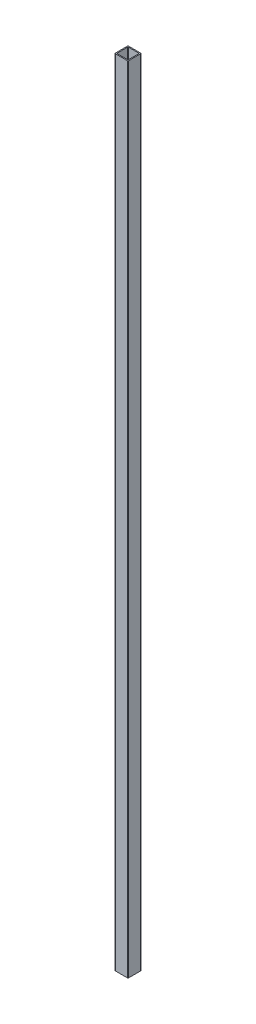
ISO-10303-21;
HEADER;
FILE_DESCRIPTION(('STEP AP214'),'2;1');
FILE_NAME('part.step','',(''),(''),'','','');
FILE_SCHEMA(('AUTOMOTIVE_DESIGN { 1 0 10303 214 1 1 1 1 }'));
ENDSEC;
DATA;
#1=APPLICATION_CONTEXT('core data for automotive mechanical design processes');
#2=APPLICATION_PROTOCOL_DEFINITION('international standard','automotive_design',2000,#1);
#3=PRODUCT_CONTEXT('',#1,'mechanical');
#4=PRODUCT('Part','Part','',(#3));
#5=PRODUCT_RELATED_PRODUCT_CATEGORY('part','',(#4));
#6=PRODUCT_DEFINITION_FORMATION('','',#4);
#7=PRODUCT_DEFINITION_CONTEXT('part definition',#1,'design');
#8=PRODUCT_DEFINITION('design','',#6,#7);
#9=PRODUCT_DEFINITION_SHAPE('','',#8);
#10=(LENGTH_UNIT() NAMED_UNIT(*) SI_UNIT(.MILLI.,.METRE.));
#11=(NAMED_UNIT(*) PLANE_ANGLE_UNIT() SI_UNIT($,.RADIAN.));
#12=(NAMED_UNIT(*) SI_UNIT($,.STERADIAN.) SOLID_ANGLE_UNIT());
#13=UNCERTAINTY_MEASURE_WITH_UNIT(LENGTH_MEASURE(1.E-05),#10,'distance_accuracy_value','');
#14=(GEOMETRIC_REPRESENTATION_CONTEXT(3) GLOBAL_UNCERTAINTY_ASSIGNED_CONTEXT((#13)) GLOBAL_UNIT_ASSIGNED_CONTEXT((#10,
#11,#12)) REPRESENTATION_CONTEXT('',''));
#15=CARTESIAN_POINT('',(0.,0.,0.));
#16=DIRECTION('',(0.,0.,1.));
#17=DIRECTION('',(1.,0.,0.));
#18=AXIS2_PLACEMENT_3D('',#15,#16,#17);
#19=CARTESIAN_POINT('',(-9.,1200.,-9.));
#20=DIRECTION('',(0.,-1.,0.));
#21=DIRECTION('',(0.,0.,1.));
#22=AXIS2_PLACEMENT_3D('',#19,#20,#21);
#23=PLANE('',#22);
#24=CARTESIAN_POINT('',(-9.,1200.,-9.));
#25=DIRECTION('',(0.,-1.,0.));
#26=DIRECTION('',(0.,0.,1.));
#27=AXIS2_PLACEMENT_3D('',#24,#25,#26);
#28=CIRCLE('',#27,0.999999999999999);
#29=CARTESIAN_POINT('',(-10.,1200.,-8.99999999999999));
#30=VERTEX_POINT('',#29);
#31=CARTESIAN_POINT('',(-8.99999999999999,1200.,-10.));
#32=VERTEX_POINT('',#31);
#33=EDGE_CURVE('E215',#30,#32,#28,.T.);
#34=ORIENTED_EDGE('',*,*,#33,.F.);
#35=DIRECTION('',(0.,0.,-1.));
#36=VECTOR('',#35,1.);
#37=CARTESIAN_POINT('',(-10.,1200.,-8.99999999999999));
#38=LINE('',#37,#36);
#39=CARTESIAN_POINT('',(-10.,1200.,8.99999999999999));
#40=VERTEX_POINT('',#39);
#41=EDGE_CURVE('E237',#40,#30,#38,.T.);
#42=ORIENTED_EDGE('',*,*,#41,.F.);
#43=CARTESIAN_POINT('',(-9.,1200.,9.));
#44=DIRECTION('',(0.,-1.,0.));
#45=DIRECTION('',(0.,0.,1.));
#46=AXIS2_PLACEMENT_3D('',#43,#44,#45);
#47=CIRCLE('',#46,0.999999999999999);
#48=CARTESIAN_POINT('',(-8.99999999999999,1200.,10.));
#49=VERTEX_POINT('',#48);
#50=EDGE_CURVE('E234',#49,#40,#47,.T.);
#51=ORIENTED_EDGE('',*,*,#50,.F.);
#52=DIRECTION('',(-1.,0.,0.));
#53=VECTOR('',#52,1.);
#54=CARTESIAN_POINT('',(-8.99999999999999,1200.,10.));
#55=LINE('',#54,#53);
#56=CARTESIAN_POINT('',(8.99999999999999,1200.,10.));
#57=VERTEX_POINT('',#56);
#58=EDGE_CURVE('E231',#57,#49,#55,.T.);
#59=ORIENTED_EDGE('',*,*,#58,.F.);
#60=CARTESIAN_POINT('',(9.,1200.,9.));
#61=DIRECTION('',(0.,-1.,0.));
#62=DIRECTION('',(0.,0.,1.));
#63=AXIS2_PLACEMENT_3D('',#60,#61,#62);
#64=CIRCLE('',#63,0.999999999999999);
#65=CARTESIAN_POINT('',(10.,1200.,8.99999999999999));
#66=VERTEX_POINT('',#65);
#67=EDGE_CURVE('E228',#66,#57,#64,.T.);
#68=ORIENTED_EDGE('',*,*,#67,.F.);
#69=DIRECTION('',(0.,0.,1.));
#70=VECTOR('',#69,1.);
#71=CARTESIAN_POINT('',(10.,1200.,-8.99999999999999));
#72=LINE('',#71,#70);
#73=CARTESIAN_POINT('',(10.,1200.,-8.99999999999999));
#74=VERTEX_POINT('',#73);
#75=EDGE_CURVE('E225',#74,#66,#72,.T.);
#76=ORIENTED_EDGE('',*,*,#75,.F.);
#77=CARTESIAN_POINT('',(9.,1200.,-9.));
#78=DIRECTION('',(0.,-1.,0.));
#79=DIRECTION('',(0.,0.,-1.));
#80=AXIS2_PLACEMENT_3D('',#77,#78,#79);
#81=CIRCLE('',#80,0.999999999999999);
#82=CARTESIAN_POINT('',(8.99999999999999,1200.,-10.));
#83=VERTEX_POINT('',#82);
#84=EDGE_CURVE('E222',#83,#74,#81,.T.);
#85=ORIENTED_EDGE('',*,*,#84,.F.);
#86=DIRECTION('',(1.,0.,0.));
#87=VECTOR('',#86,1.);
#88=CARTESIAN_POINT('',(-8.99999999999999,1200.,-10.));
#89=LINE('',#88,#87);
#90=EDGE_CURVE('E218',#32,#83,#89,.T.);
#91=ORIENTED_EDGE('',*,*,#90,.F.);
#92=EDGE_LOOP('',(#34,#42,#51,#59,#68,#76,#85,#91));
#93=FACE_BOUND('',#92,.T.);
#94=CARTESIAN_POINT('',(-7.5,1200.,-7.5));
#95=DIRECTION('',(0.,-1.,0.));
#96=DIRECTION('',(0.,0.,1.));
#97=AXIS2_PLACEMENT_3D('',#94,#95,#96);
#98=CIRCLE('',#97,1.);
#99=CARTESIAN_POINT('',(-8.5,1200.,-7.49999999999999));
#100=VERTEX_POINT('',#99);
#101=CARTESIAN_POINT('',(-7.5,1200.,-8.5));
#102=VERTEX_POINT('',#101);
#103=EDGE_CURVE('E150',#100,#102,#98,.T.);
#104=ORIENTED_EDGE('',*,*,#103,.T.);
#105=DIRECTION('',(1.,0.,0.));
#106=VECTOR('',#105,1.);
#107=CARTESIAN_POINT('',(-7.5,1200.,-8.5));
#108=LINE('',#107,#106);
#109=CARTESIAN_POINT('',(7.49999999999999,1200.,-8.5));
#110=VERTEX_POINT('',#109);
#111=EDGE_CURVE('E159',#102,#110,#108,.T.);
#112=ORIENTED_EDGE('',*,*,#111,.T.);
#113=CARTESIAN_POINT('',(7.5,1200.,-7.5));
#114=DIRECTION('',(0.,-1.,0.));
#115=DIRECTION('',(0.,0.,-1.));
#116=AXIS2_PLACEMENT_3D('',#113,#114,#115);
#117=CIRCLE('',#116,1.);
#118=CARTESIAN_POINT('',(8.5,1200.,-7.49999999999999));
#119=VERTEX_POINT('',#118);
#120=EDGE_CURVE('E164',#110,#119,#117,.T.);
#121=ORIENTED_EDGE('',*,*,#120,.T.);
#122=DIRECTION('',(0.,0.,1.));
#123=VECTOR('',#122,1.);
#124=CARTESIAN_POINT('',(8.5,1200.,-7.49999999999999));
#125=LINE('',#124,#123);
#126=CARTESIAN_POINT('',(8.5,1200.,7.49999999999999));
#127=VERTEX_POINT('',#126);
#128=EDGE_CURVE('E176',#119,#127,#125,.T.);
#129=ORIENTED_EDGE('',*,*,#128,.T.);
#130=CARTESIAN_POINT('',(7.5,1200.,7.5));
#131=DIRECTION('',(0.,-1.,0.));
#132=DIRECTION('',(0.,0.,1.));
#133=AXIS2_PLACEMENT_3D('',#130,#131,#132);
#134=CIRCLE('',#133,1.);
#135=CARTESIAN_POINT('',(7.49999999999999,1200.,8.5));
#136=VERTEX_POINT('',#135);
#137=EDGE_CURVE('E179',#127,#136,#134,.T.);
#138=ORIENTED_EDGE('',*,*,#137,.T.);
#139=DIRECTION('',(-1.,0.,0.));
#140=VECTOR('',#139,1.);
#141=CARTESIAN_POINT('',(-7.5,1200.,8.5));
#142=LINE('',#141,#140);
#143=CARTESIAN_POINT('',(-7.5,1200.,8.5));
#144=VERTEX_POINT('',#143);
#145=EDGE_CURVE('E182',#136,#144,#142,.T.);
#146=ORIENTED_EDGE('',*,*,#145,.T.);
#147=CARTESIAN_POINT('',(-7.5,1200.,7.5));
#148=DIRECTION('',(0.,-1.,0.));
#149=DIRECTION('',(0.,0.,1.));
#150=AXIS2_PLACEMENT_3D('',#147,#148,#149);
#151=CIRCLE('',#150,1.);
#152=CARTESIAN_POINT('',(-8.5,1200.,7.49999999999999));
#153=VERTEX_POINT('',#152);
#154=EDGE_CURVE('E185',#144,#153,#151,.T.);
#155=ORIENTED_EDGE('',*,*,#154,.T.);
#156=DIRECTION('',(0.,0.,-1.));
#157=VECTOR('',#156,1.);
#158=CARTESIAN_POINT('',(-8.5,1200.,-7.49999999999999));
#159=LINE('',#158,#157);
#160=EDGE_CURVE('E168',#153,#100,#159,.T.);
#161=ORIENTED_EDGE('',*,*,#160,.T.);
#162=EDGE_LOOP('',(#104,#112,#121,#129,#138,#146,#155,#161));
#163=FACE_BOUND('',#162,.T.);
#164=ADVANCED_FACE('F35',(#93,#163),#23,.F.);
#165=CARTESIAN_POINT('',(-9.,0.,-9.));
#166=DIRECTION('',(0.,-1.,0.));
#167=DIRECTION('',(0.,0.,1.));
#168=AXIS2_PLACEMENT_3D('',#165,#166,#167);
#169=PLANE('',#168);
#170=CARTESIAN_POINT('',(-9.,0.,-9.));
#171=DIRECTION('',(0.,-1.,0.));
#172=DIRECTION('',(0.,0.,1.));
#173=AXIS2_PLACEMENT_3D('',#170,#171,#172);
#174=CIRCLE('',#173,0.999999999999999);
#175=CARTESIAN_POINT('',(-10.,0.,-8.99999999999999));
#176=VERTEX_POINT('',#175);
#177=CARTESIAN_POINT('',(-8.99999999999999,0.,-10.));
#178=VERTEX_POINT('',#177);
#179=EDGE_CURVE('E155',#176,#178,#174,.T.);
#180=ORIENTED_EDGE('',*,*,#179,.T.);
#181=DIRECTION('',(1.,0.,0.));
#182=VECTOR('',#181,1.);
#183=CARTESIAN_POINT('',(-8.99999999999999,0.,-10.));
#184=LINE('',#183,#182);
#185=CARTESIAN_POINT('',(8.99999999999999,0.,-10.));
#186=VERTEX_POINT('',#185);
#187=EDGE_CURVE('E243',#178,#186,#184,.T.);
#188=ORIENTED_EDGE('',*,*,#187,.T.);
#189=CARTESIAN_POINT('',(9.,0.,-9.));
#190=DIRECTION('',(0.,-1.,0.));
#191=DIRECTION('',(0.,0.,-1.));
#192=AXIS2_PLACEMENT_3D('',#189,#190,#191);
#193=CIRCLE('',#192,0.999999999999999);
#194=CARTESIAN_POINT('',(10.,0.,-8.99999999999999));
#195=VERTEX_POINT('',#194);
#196=EDGE_CURVE('E246',#186,#195,#193,.T.);
#197=ORIENTED_EDGE('',*,*,#196,.T.);
#198=DIRECTION('',(0.,0.,1.));
#199=VECTOR('',#198,1.);
#200=CARTESIAN_POINT('',(10.,0.,-8.99999999999999));
#201=LINE('',#200,#199);
#202=CARTESIAN_POINT('',(10.,0.,8.99999999999999));
#203=VERTEX_POINT('',#202);
#204=EDGE_CURVE('E249',#195,#203,#201,.T.);
#205=ORIENTED_EDGE('',*,*,#204,.T.);
#206=CARTESIAN_POINT('',(9.,0.,9.));
#207=DIRECTION('',(0.,-1.,0.));
#208=DIRECTION('',(0.,0.,1.));
#209=AXIS2_PLACEMENT_3D('',#206,#207,#208);
#210=CIRCLE('',#209,0.999999999999999);
#211=CARTESIAN_POINT('',(8.99999999999999,0.,10.));
#212=VERTEX_POINT('',#211);
#213=EDGE_CURVE('E252',#203,#212,#210,.T.);
#214=ORIENTED_EDGE('',*,*,#213,.T.);
#215=DIRECTION('',(-1.,0.,0.));
#216=VECTOR('',#215,1.);
#217=CARTESIAN_POINT('',(-8.99999999999999,0.,10.));
#218=LINE('',#217,#216);
#219=CARTESIAN_POINT('',(-8.99999999999999,0.,10.));
#220=VERTEX_POINT('',#219);
#221=EDGE_CURVE('E255',#212,#220,#218,.T.);
#222=ORIENTED_EDGE('',*,*,#221,.T.);
#223=CARTESIAN_POINT('',(-9.,0.,9.));
#224=DIRECTION('',(0.,-1.,0.));
#225=DIRECTION('',(0.,0.,1.));
#226=AXIS2_PLACEMENT_3D('',#223,#224,#225);
#227=CIRCLE('',#226,0.999999999999999);
#228=CARTESIAN_POINT('',(-10.,0.,8.99999999999999));
#229=VERTEX_POINT('',#228);
#230=EDGE_CURVE('E258',#220,#229,#227,.T.);
#231=ORIENTED_EDGE('',*,*,#230,.T.);
#232=DIRECTION('',(0.,0.,-1.));
#233=VECTOR('',#232,1.);
#234=CARTESIAN_POINT('',(-10.,0.,-8.99999999999999));
#235=LINE('',#234,#233);
#236=EDGE_CURVE('E219',#229,#176,#235,.T.);
#237=ORIENTED_EDGE('',*,*,#236,.T.);
#238=EDGE_LOOP('',(#180,#188,#197,#205,#214,#222,#231,#237));
#239=FACE_BOUND('',#238,.T.);
#240=DIRECTION('',(0.,0.,-1.));
#241=VECTOR('',#240,1.);
#242=CARTESIAN_POINT('',(-8.5,0.,-7.49999999999999));
#243=LINE('',#242,#241);
#244=CARTESIAN_POINT('',(-8.5,0.,7.49999999999999));
#245=VERTEX_POINT('',#244);
#246=CARTESIAN_POINT('',(-8.5,0.,-7.49999999999999));
#247=VERTEX_POINT('',#246);
#248=EDGE_CURVE('E169',#245,#247,#243,.T.);
#249=ORIENTED_EDGE('',*,*,#248,.F.);
#250=CARTESIAN_POINT('',(-7.5,0.,7.5));
#251=DIRECTION('',(0.,-1.,0.));
#252=DIRECTION('',(0.,0.,1.));
#253=AXIS2_PLACEMENT_3D('',#250,#251,#252);
#254=CIRCLE('',#253,1.);
#255=CARTESIAN_POINT('',(-7.5,0.,8.5));
#256=VERTEX_POINT('',#255);
#257=EDGE_CURVE('E172',#256,#245,#254,.T.);
#258=ORIENTED_EDGE('',*,*,#257,.F.);
#259=DIRECTION('',(-1.,0.,0.));
#260=VECTOR('',#259,1.);
#261=CARTESIAN_POINT('',(-7.5,0.,8.5));
#262=LINE('',#261,#260);
#263=CARTESIAN_POINT('',(7.49999999999999,0.,8.5));
#264=VERTEX_POINT('',#263);
#265=EDGE_CURVE('E200',#264,#256,#262,.T.);
#266=ORIENTED_EDGE('',*,*,#265,.F.);
#267=CARTESIAN_POINT('',(7.5,0.,7.5));
#268=DIRECTION('',(0.,-1.,0.));
#269=DIRECTION('',(0.,0.,1.));
#270=AXIS2_PLACEMENT_3D('',#267,#268,#269);
#271=CIRCLE('',#270,1.);
#272=CARTESIAN_POINT('',(8.5,0.,7.49999999999999));
#273=VERTEX_POINT('',#272);
#274=EDGE_CURVE('E197',#273,#264,#271,.T.);
#275=ORIENTED_EDGE('',*,*,#274,.F.);
#276=DIRECTION('',(0.,0.,1.));
#277=VECTOR('',#276,1.);
#278=CARTESIAN_POINT('',(8.5,0.,-7.49999999999999));
#279=LINE('',#278,#277);
#280=CARTESIAN_POINT('',(8.5,0.,-7.49999999999999));
#281=VERTEX_POINT('',#280);
#282=EDGE_CURVE('E194',#281,#273,#279,.T.);
#283=ORIENTED_EDGE('',*,*,#282,.F.);
#284=CARTESIAN_POINT('',(7.5,0.,-7.5));
#285=DIRECTION('',(0.,-1.,0.));
#286=DIRECTION('',(0.,0.,-1.));
#287=AXIS2_PLACEMENT_3D('',#284,#285,#286);
#288=CIRCLE('',#287,1.);
#289=CARTESIAN_POINT('',(7.49999999999999,0.,-8.5));
#290=VERTEX_POINT('',#289);
#291=EDGE_CURVE('E191',#290,#281,#288,.T.);
#292=ORIENTED_EDGE('',*,*,#291,.F.);
#293=DIRECTION('',(1.,0.,0.));
#294=VECTOR('',#293,1.);
#295=CARTESIAN_POINT('',(-7.5,0.,-8.5));
#296=LINE('',#295,#294);
#297=CARTESIAN_POINT('',(-7.5,0.,-8.5));
#298=VERTEX_POINT('',#297);
#299=EDGE_CURVE('E189',#298,#290,#296,.T.);
#300=ORIENTED_EDGE('',*,*,#299,.F.);
#301=CARTESIAN_POINT('',(-7.5,0.,-7.5));
#302=DIRECTION('',(0.,-1.,0.));
#303=DIRECTION('',(0.,0.,1.));
#304=AXIS2_PLACEMENT_3D('',#301,#302,#303);
#305=CIRCLE('',#304,1.);
#306=EDGE_CURVE('E151',#247,#298,#305,.T.);
#307=ORIENTED_EDGE('',*,*,#306,.F.);
#308=EDGE_LOOP('',(#249,#258,#266,#275,#283,#292,#300,#307));
#309=FACE_BOUND('',#308,.T.);
#310=ADVANCED_FACE('F283',(#239,#309),#169,.T.);
#311=CARTESIAN_POINT('',(-9.,1200.,-9.));
#312=DIRECTION('',(0.,-1.,0.));
#313=DIRECTION('',(0.,0.,1.));
#314=AXIS2_PLACEMENT_3D('',#311,#312,#313);
#315=CYLINDRICAL_SURFACE('',#314,0.999999999999999);
#316=ORIENTED_EDGE('',*,*,#179,.F.);
#317=DIRECTION('',(0.,-1.,0.));
#318=VECTOR('',#317,1.);
#319=CARTESIAN_POINT('',(-10.,1200.,-8.99999999999999));
#320=LINE('',#319,#318);
#321=EDGE_CURVE('E240',#30,#176,#320,.T.);
#322=ORIENTED_EDGE('',*,*,#321,.F.);
#323=ORIENTED_EDGE('',*,*,#33,.T.);
#324=DIRECTION('',(0.,-1.,0.));
#325=VECTOR('',#324,1.);
#326=CARTESIAN_POINT('',(-8.99999999999999,1200.,-10.));
#327=LINE('',#326,#325);
#328=EDGE_CURVE('E11',#32,#178,#327,.T.);
#329=ORIENTED_EDGE('',*,*,#328,.T.);
#330=EDGE_LOOP('',(#316,#322,#323,#329));
#331=FACE_BOUND('',#330,.T.);
#332=ADVANCED_FACE('F37',(#331),#315,.T.);
#333=CARTESIAN_POINT('',(-8.99999999999999,1200.,-10.));
#334=DIRECTION('',(0.,0.,1.));
#335=DIRECTION('',(-1.,0.,0.));
#336=AXIS2_PLACEMENT_3D('',#333,#334,#335);
#337=PLANE('',#336);
#338=ORIENTED_EDGE('',*,*,#187,.F.);
#339=ORIENTED_EDGE('',*,*,#328,.F.);
#340=ORIENTED_EDGE('',*,*,#90,.T.);
#341=DIRECTION('',(0.,-1.,0.));
#342=VECTOR('',#341,1.);
#343=CARTESIAN_POINT('',(8.99999999999999,1200.,-10.));
#344=LINE('',#343,#342);
#345=EDGE_CURVE('E43',#83,#186,#344,.T.);
#346=ORIENTED_EDGE('',*,*,#345,.T.);
#347=EDGE_LOOP('',(#338,#339,#340,#346));
#348=FACE_BOUND('',#347,.T.);
#349=ADVANCED_FACE('F276',(#348),#337,.F.);
#350=CARTESIAN_POINT('',(9.,1200.,-9.));
#351=DIRECTION('',(0.,-1.,0.));
#352=DIRECTION('',(0.,0.,1.));
#353=AXIS2_PLACEMENT_3D('',#350,#351,#352);
#354=CYLINDRICAL_SURFACE('',#353,0.999999999999999);
#355=ORIENTED_EDGE('',*,*,#196,.F.);
#356=ORIENTED_EDGE('',*,*,#345,.F.);
#357=ORIENTED_EDGE('',*,*,#84,.T.);
#358=DIRECTION('',(0.,-1.,0.));
#359=VECTOR('',#358,1.);
#360=CARTESIAN_POINT('',(10.,1200.,-8.99999999999999));
#361=LINE('',#360,#359);
#362=EDGE_CURVE('E272',#74,#195,#361,.T.);
#363=ORIENTED_EDGE('',*,*,#362,.T.);
#364=EDGE_LOOP('',(#355,#356,#357,#363));
#365=FACE_BOUND('',#364,.T.);
#366=ADVANCED_FACE('F280',(#365),#354,.T.);
#367=CARTESIAN_POINT('',(10.,1200.,-8.99999999999999));
#368=DIRECTION('',(-1.,0.,0.));
#369=DIRECTION('',(0.,0.,-1.));
#370=AXIS2_PLACEMENT_3D('',#367,#368,#369);
#371=PLANE('',#370);
#372=ORIENTED_EDGE('',*,*,#204,.F.);
#373=ORIENTED_EDGE('',*,*,#362,.F.);
#374=ORIENTED_EDGE('',*,*,#75,.T.);
#375=DIRECTION('',(0.,-1.,0.));
#376=VECTOR('',#375,1.);
#377=CARTESIAN_POINT('',(10.,1200.,8.99999999999999));
#378=LINE('',#377,#376);
#379=EDGE_CURVE('E270',#66,#203,#378,.T.);
#380=ORIENTED_EDGE('',*,*,#379,.T.);
#381=EDGE_LOOP('',(#372,#373,#374,#380));
#382=FACE_BOUND('',#381,.T.);
#383=ADVANCED_FACE('F295',(#382),#371,.F.);
#384=CARTESIAN_POINT('',(9.,1200.,9.));
#385=DIRECTION('',(0.,-1.,0.));
#386=DIRECTION('',(0.,0.,1.));
#387=AXIS2_PLACEMENT_3D('',#384,#385,#386);
#388=CYLINDRICAL_SURFACE('',#387,0.999999999999999);
#389=ORIENTED_EDGE('',*,*,#213,.F.);
#390=ORIENTED_EDGE('',*,*,#379,.F.);
#391=ORIENTED_EDGE('',*,*,#67,.T.);
#392=DIRECTION('',(0.,-1.,0.));
#393=VECTOR('',#392,1.);
#394=CARTESIAN_POINT('',(8.99999999999999,1200.,10.));
#395=LINE('',#394,#393);
#396=EDGE_CURVE('E268',#57,#212,#395,.T.);
#397=ORIENTED_EDGE('',*,*,#396,.T.);
#398=EDGE_LOOP('',(#389,#390,#391,#397));
#399=FACE_BOUND('',#398,.T.);
#400=ADVANCED_FACE('F299',(#399),#388,.T.);
#401=CARTESIAN_POINT('',(-8.99999999999999,1200.,10.));
#402=DIRECTION('',(0.,0.,-1.));
#403=DIRECTION('',(1.,0.,0.));
#404=AXIS2_PLACEMENT_3D('',#401,#402,#403);
#405=PLANE('',#404);
#406=ORIENTED_EDGE('',*,*,#221,.F.);
#407=ORIENTED_EDGE('',*,*,#396,.F.);
#408=ORIENTED_EDGE('',*,*,#58,.T.);
#409=DIRECTION('',(0.,-1.,0.));
#410=VECTOR('',#409,1.);
#411=CARTESIAN_POINT('',(-8.99999999999999,1200.,10.));
#412=LINE('',#411,#410);
#413=EDGE_CURVE('E266',#49,#220,#412,.T.);
#414=ORIENTED_EDGE('',*,*,#413,.T.);
#415=EDGE_LOOP('',(#406,#407,#408,#414));
#416=FACE_BOUND('',#415,.T.);
#417=ADVANCED_FACE('F301',(#416),#405,.F.);
#418=CARTESIAN_POINT('',(-9.,1200.,9.));
#419=DIRECTION('',(0.,-1.,0.));
#420=DIRECTION('',(0.,0.,1.));
#421=AXIS2_PLACEMENT_3D('',#418,#419,#420);
#422=CYLINDRICAL_SURFACE('',#421,0.999999999999999);
#423=ORIENTED_EDGE('',*,*,#230,.F.);
#424=ORIENTED_EDGE('',*,*,#413,.F.);
#425=ORIENTED_EDGE('',*,*,#50,.T.);
#426=DIRECTION('',(0.,-1.,0.));
#427=VECTOR('',#426,1.);
#428=CARTESIAN_POINT('',(-10.,1200.,8.99999999999999));
#429=LINE('',#428,#427);
#430=EDGE_CURVE('E264',#40,#229,#429,.T.);
#431=ORIENTED_EDGE('',*,*,#430,.T.);
#432=EDGE_LOOP('',(#423,#424,#425,#431));
#433=FACE_BOUND('',#432,.T.);
#434=ADVANCED_FACE('F305',(#433),#422,.T.);
#435=CARTESIAN_POINT('',(-10.,1200.,-8.99999999999999));
#436=DIRECTION('',(1.,0.,0.));
#437=DIRECTION('',(0.,0.,1.));
#438=AXIS2_PLACEMENT_3D('',#435,#436,#437);
#439=PLANE('',#438);
#440=ORIENTED_EDGE('',*,*,#236,.F.);
#441=ORIENTED_EDGE('',*,*,#430,.F.);
#442=ORIENTED_EDGE('',*,*,#41,.T.);
#443=ORIENTED_EDGE('',*,*,#321,.T.);
#444=EDGE_LOOP('',(#440,#441,#442,#443));
#445=FACE_BOUND('',#444,.T.);
#446=ADVANCED_FACE('F307',(#445),#439,.F.);
#447=CARTESIAN_POINT('',(-7.5,1200.,-7.5));
#448=DIRECTION('',(0.,-1.,0.));
#449=DIRECTION('',(0.,0.,1.));
#450=AXIS2_PLACEMENT_3D('',#447,#448,#449);
#451=CYLINDRICAL_SURFACE('',#450,1.);
#452=ORIENTED_EDGE('',*,*,#306,.T.);
#453=DIRECTION('',(0.,-1.,0.));
#454=VECTOR('',#453,1.);
#455=CARTESIAN_POINT('',(-7.5,1200.,-8.5));
#456=LINE('',#455,#454);
#457=EDGE_CURVE('E146',#102,#298,#456,.T.);
#458=ORIENTED_EDGE('',*,*,#457,.F.);
#459=ORIENTED_EDGE('',*,*,#103,.F.);
#460=DIRECTION('',(0.,-1.,0.));
#461=VECTOR('',#460,1.);
#462=CARTESIAN_POINT('',(-8.5,1200.,-7.49999999999999));
#463=LINE('',#462,#461);
#464=EDGE_CURVE('E58',#100,#247,#463,.T.);
#465=ORIENTED_EDGE('',*,*,#464,.T.);
#466=EDGE_LOOP('',(#452,#458,#459,#465));
#467=FACE_BOUND('',#466,.T.);
#468=ADVANCED_FACE('F148',(#467),#451,.F.);
#469=CARTESIAN_POINT('',(-7.5,1200.,-8.5));
#470=DIRECTION('',(0.,0.,1.));
#471=DIRECTION('',(-1.,0.,0.));
#472=AXIS2_PLACEMENT_3D('',#469,#470,#471);
#473=PLANE('',#472);
#474=ORIENTED_EDGE('',*,*,#299,.T.);
#475=DIRECTION('',(0.,-1.,0.));
#476=VECTOR('',#475,1.);
#477=CARTESIAN_POINT('',(7.49999999999999,1200.,-8.5));
#478=LINE('',#477,#476);
#479=EDGE_CURVE('E156',#110,#290,#478,.T.);
#480=ORIENTED_EDGE('',*,*,#479,.F.);
#481=ORIENTED_EDGE('',*,*,#111,.F.);
#482=ORIENTED_EDGE('',*,*,#457,.T.);
#483=EDGE_LOOP('',(#474,#480,#481,#482));
#484=FACE_BOUND('',#483,.T.);
#485=ADVANCED_FACE('F160',(#484),#473,.T.);
#486=CARTESIAN_POINT('',(7.5,1200.,-7.5));
#487=DIRECTION('',(0.,-1.,0.));
#488=DIRECTION('',(0.,0.,1.));
#489=AXIS2_PLACEMENT_3D('',#486,#487,#488);
#490=CYLINDRICAL_SURFACE('',#489,1.);
#491=ORIENTED_EDGE('',*,*,#291,.T.);
#492=DIRECTION('',(0.,-1.,0.));
#493=VECTOR('',#492,1.);
#494=CARTESIAN_POINT('',(8.5,1200.,-7.49999999999999));
#495=LINE('',#494,#493);
#496=EDGE_CURVE('E212',#119,#281,#495,.T.);
#497=ORIENTED_EDGE('',*,*,#496,.F.);
#498=ORIENTED_EDGE('',*,*,#120,.F.);
#499=ORIENTED_EDGE('',*,*,#479,.T.);
#500=EDGE_LOOP('',(#491,#497,#498,#499));
#501=FACE_BOUND('',#500,.T.);
#502=ADVANCED_FACE('F325',(#501),#490,.F.);
#503=CARTESIAN_POINT('',(8.5,1200.,-7.49999999999999));
#504=DIRECTION('',(-1.,0.,0.));
#505=DIRECTION('',(0.,0.,-1.));
#506=AXIS2_PLACEMENT_3D('',#503,#504,#505);
#507=PLANE('',#506);
#508=ORIENTED_EDGE('',*,*,#282,.T.);
#509=DIRECTION('',(0.,-1.,0.));
#510=VECTOR('',#509,1.);
#511=CARTESIAN_POINT('',(8.5,1200.,7.49999999999999));
#512=LINE('',#511,#510);
#513=EDGE_CURVE('E210',#127,#273,#512,.T.);
#514=ORIENTED_EDGE('',*,*,#513,.F.);
#515=ORIENTED_EDGE('',*,*,#128,.F.);
#516=ORIENTED_EDGE('',*,*,#496,.T.);
#517=EDGE_LOOP('',(#508,#514,#515,#516));
#518=FACE_BOUND('',#517,.T.);
#519=ADVANCED_FACE('F328',(#518),#507,.T.);
#520=CARTESIAN_POINT('',(7.5,1200.,7.5));
#521=DIRECTION('',(0.,-1.,0.));
#522=DIRECTION('',(0.,0.,1.));
#523=AXIS2_PLACEMENT_3D('',#520,#521,#522);
#524=CYLINDRICAL_SURFACE('',#523,1.);
#525=ORIENTED_EDGE('',*,*,#274,.T.);
#526=DIRECTION('',(0.,-1.,0.));
#527=VECTOR('',#526,1.);
#528=CARTESIAN_POINT('',(7.49999999999999,1200.,8.5));
#529=LINE('',#528,#527);
#530=EDGE_CURVE('E208',#136,#264,#529,.T.);
#531=ORIENTED_EDGE('',*,*,#530,.F.);
#532=ORIENTED_EDGE('',*,*,#137,.F.);
#533=ORIENTED_EDGE('',*,*,#513,.T.);
#534=EDGE_LOOP('',(#525,#531,#532,#533));
#535=FACE_BOUND('',#534,.T.);
#536=ADVANCED_FACE('F332',(#535),#524,.F.);
#537=CARTESIAN_POINT('',(-7.5,1200.,8.5));
#538=DIRECTION('',(0.,0.,-1.));
#539=DIRECTION('',(1.,0.,0.));
#540=AXIS2_PLACEMENT_3D('',#537,#538,#539);
#541=PLANE('',#540);
#542=ORIENTED_EDGE('',*,*,#265,.T.);
#543=DIRECTION('',(0.,-1.,0.));
#544=VECTOR('',#543,1.);
#545=CARTESIAN_POINT('',(-7.5,1200.,8.5));
#546=LINE('',#545,#544);
#547=EDGE_CURVE('E206',#144,#256,#546,.T.);
#548=ORIENTED_EDGE('',*,*,#547,.F.);
#549=ORIENTED_EDGE('',*,*,#145,.F.);
#550=ORIENTED_EDGE('',*,*,#530,.T.);
#551=EDGE_LOOP('',(#542,#548,#549,#550));
#552=FACE_BOUND('',#551,.T.);
#553=ADVANCED_FACE('F336',(#552),#541,.T.);
#554=CARTESIAN_POINT('',(-7.5,1200.,7.5));
#555=DIRECTION('',(0.,-1.,0.));
#556=DIRECTION('',(0.,0.,1.));
#557=AXIS2_PLACEMENT_3D('',#554,#555,#556);
#558=CYLINDRICAL_SURFACE('',#557,1.);
#559=ORIENTED_EDGE('',*,*,#257,.T.);
#560=DIRECTION('',(0.,-1.,0.));
#561=VECTOR('',#560,1.);
#562=CARTESIAN_POINT('',(-8.5,1200.,7.49999999999999));
#563=LINE('',#562,#561);
#564=EDGE_CURVE('E50',#153,#245,#563,.T.);
#565=ORIENTED_EDGE('',*,*,#564,.F.);
#566=ORIENTED_EDGE('',*,*,#154,.F.);
#567=ORIENTED_EDGE('',*,*,#547,.T.);
#568=EDGE_LOOP('',(#559,#565,#566,#567));
#569=FACE_BOUND('',#568,.T.);
#570=ADVANCED_FACE('F340',(#569),#558,.F.);
#571=CARTESIAN_POINT('',(-8.5,1200.,-7.49999999999999));
#572=DIRECTION('',(1.,0.,0.));
#573=DIRECTION('',(0.,0.,1.));
#574=AXIS2_PLACEMENT_3D('',#571,#572,#573);
#575=PLANE('',#574);
#576=ORIENTED_EDGE('',*,*,#248,.T.);
#577=ORIENTED_EDGE('',*,*,#464,.F.);
#578=ORIENTED_EDGE('',*,*,#160,.F.);
#579=ORIENTED_EDGE('',*,*,#564,.T.);
#580=EDGE_LOOP('',(#576,#577,#578,#579));
#581=FACE_BOUND('',#580,.T.);
#582=ADVANCED_FACE('F344',(#581),#575,.T.);
#583=CLOSED_SHELL('',(#164,#310,#332,#349,#366,#383,#400,#417,#434,#446,#468,#485,#502,#519,
#536,#553,#570,#582));
#584=MANIFOLD_SOLID_BREP('B2',#583);
#585=ADVANCED_BREP_SHAPE_REPRESENTATION('',(#18,#584),#14);
#586=SHAPE_DEFINITION_REPRESENTATION(#9,#585);
ENDSEC;
END-ISO-10303-21;
